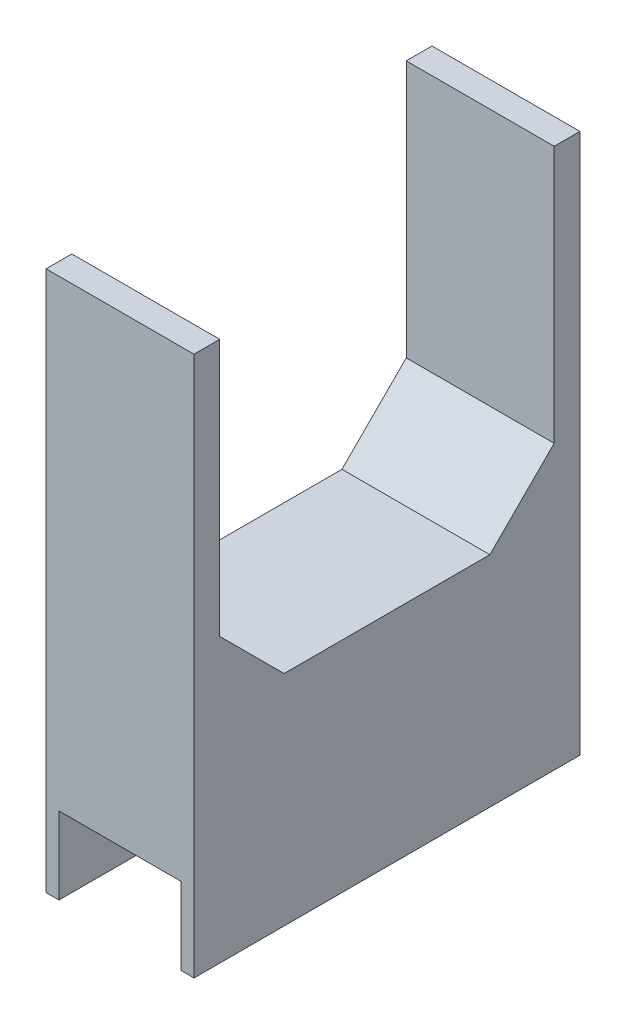
ISO-10303-21;
HEADER;
FILE_DESCRIPTION(('STEP AP214'),'2;1');
FILE_NAME('part.step','',(''),(''),'','','');
FILE_SCHEMA(('AUTOMOTIVE_DESIGN { 1 0 10303 214 1 1 1 1 }'));
ENDSEC;
DATA;
#1=APPLICATION_CONTEXT('core data for automotive mechanical design processes');
#2=APPLICATION_PROTOCOL_DEFINITION('international standard','automotive_design',2000,#1);
#3=PRODUCT_CONTEXT('',#1,'mechanical');
#4=PRODUCT('Part','Part','',(#3));
#5=PRODUCT_RELATED_PRODUCT_CATEGORY('part','',(#4));
#6=PRODUCT_DEFINITION_FORMATION('','',#4);
#7=PRODUCT_DEFINITION_CONTEXT('part definition',#1,'design');
#8=PRODUCT_DEFINITION('design','',#6,#7);
#9=PRODUCT_DEFINITION_SHAPE('','',#8);
#10=(LENGTH_UNIT() NAMED_UNIT(*) SI_UNIT(.MILLI.,.METRE.));
#11=(NAMED_UNIT(*) PLANE_ANGLE_UNIT() SI_UNIT($,.RADIAN.));
#12=(NAMED_UNIT(*) SI_UNIT($,.STERADIAN.) SOLID_ANGLE_UNIT());
#13=UNCERTAINTY_MEASURE_WITH_UNIT(LENGTH_MEASURE(1.E-05),#10,'distance_accuracy_value','');
#14=(GEOMETRIC_REPRESENTATION_CONTEXT(3) GLOBAL_UNCERTAINTY_ASSIGNED_CONTEXT((#13)) GLOBAL_UNIT_ASSIGNED_CONTEXT((#10,
#11,#12)) REPRESENTATION_CONTEXT('',''));
#15=CARTESIAN_POINT('',(0.,0.,0.));
#16=DIRECTION('',(0.,0.,1.));
#17=DIRECTION('',(1.,0.,0.));
#18=AXIS2_PLACEMENT_3D('',#15,#16,#17);
#19=CARTESIAN_POINT('',(0.,36.,0.));
#20=DIRECTION('',(0.,-1.,0.));
#21=DIRECTION('',(0.,0.,-1.));
#22=AXIS2_PLACEMENT_3D('',#19,#20,#21);
#23=PLANE('',#22);
#24=DIRECTION('',(0.,0.,1.));
#25=VECTOR('',#24,1.);
#26=CARTESIAN_POINT('',(-5.75,36.,15.));
#27=LINE('',#26,#25);
#28=CARTESIAN_POINT('',(-5.75,36.,-15.));
#29=VERTEX_POINT('',#28);
#30=CARTESIAN_POINT('',(-5.75,36.,-13.));
#31=VERTEX_POINT('',#30);
#32=EDGE_CURVE('E213',#29,#31,#27,.T.);
#33=ORIENTED_EDGE('',*,*,#32,.T.);
#34=DIRECTION('',(-1.,0.,0.));
#35=VECTOR('',#34,1.);
#36=CARTESIAN_POINT('',(5.75,36.,-13.));
#37=LINE('',#36,#35);
#38=CARTESIAN_POINT('',(5.75,36.,-13.));
#39=VERTEX_POINT('',#38);
#40=EDGE_CURVE('E196',#39,#31,#37,.T.);
#41=ORIENTED_EDGE('',*,*,#40,.F.);
#42=DIRECTION('',(0.,0.,-1.));
#43=VECTOR('',#42,1.);
#44=CARTESIAN_POINT('',(5.75,36.,15.));
#45=LINE('',#44,#43);
#46=CARTESIAN_POINT('',(5.75,36.,-15.));
#47=VERTEX_POINT('',#46);
#48=EDGE_CURVE('E204',#39,#47,#45,.T.);
#49=ORIENTED_EDGE('',*,*,#48,.T.);
#50=DIRECTION('',(-1.,0.,0.));
#51=VECTOR('',#50,1.);
#52=CARTESIAN_POINT('',(-5.75,36.,-15.));
#53=LINE('',#52,#51);
#54=EDGE_CURVE('E203',#47,#29,#53,.T.);
#55=ORIENTED_EDGE('',*,*,#54,.T.);
#56=EDGE_LOOP('',(#33,#41,#49,#55));
#57=FACE_BOUND('',#56,.T.);
#58=ADVANCED_FACE('F47',(#57),#23,.F.);
#59=CARTESIAN_POINT('',(0.,-6.,0.));
#60=DIRECTION('',(0.,1.,0.));
#61=DIRECTION('',(0.,0.,1.));
#62=AXIS2_PLACEMENT_3D('',#59,#60,#61);
#63=PLANE('',#62);
#64=DIRECTION('',(1.,0.,0.));
#65=VECTOR('',#64,1.);
#66=CARTESIAN_POINT('',(-5.75,-6.,-15.));
#67=LINE('',#66,#65);
#68=CARTESIAN_POINT('',(-5.75,-6.,-15.));
#69=VERTEX_POINT('',#68);
#70=CARTESIAN_POINT('',(-4.75,-6.,-15.));
#71=VERTEX_POINT('',#70);
#72=EDGE_CURVE('E313',#69,#71,#67,.T.);
#73=ORIENTED_EDGE('',*,*,#72,.T.);
#74=DIRECTION('',(0.,0.,1.));
#75=VECTOR('',#74,1.);
#76=CARTESIAN_POINT('',(-4.75,-6.,-15.));
#77=LINE('',#76,#75);
#78=CARTESIAN_POINT('',(-4.75,-6.,15.));
#79=VERTEX_POINT('',#78);
#80=EDGE_CURVE('E277',#71,#79,#77,.T.);
#81=ORIENTED_EDGE('',*,*,#80,.T.);
#82=DIRECTION('',(-1.,0.,0.));
#83=VECTOR('',#82,1.);
#84=CARTESIAN_POINT('',(-5.75,-6.,15.));
#85=LINE('',#84,#83);
#86=CARTESIAN_POINT('',(-5.75,-6.,15.));
#87=VERTEX_POINT('',#86);
#88=EDGE_CURVE('E303',#79,#87,#85,.T.);
#89=ORIENTED_EDGE('',*,*,#88,.T.);
#90=DIRECTION('',(0.,0.,-1.));
#91=VECTOR('',#90,1.);
#92=CARTESIAN_POINT('',(-5.75,-6.,-15.));
#93=LINE('',#92,#91);
#94=EDGE_CURVE('E308',#87,#69,#93,.T.);
#95=ORIENTED_EDGE('',*,*,#94,.T.);
#96=EDGE_LOOP('',(#73,#81,#89,#95));
#97=FACE_BOUND('',#96,.T.);
#98=ADVANCED_FACE('F406',(#97),#63,.F.);
#99=CARTESIAN_POINT('',(5.75,11.,15.));
#100=DIRECTION('',(-1.,0.,0.));
#101=DIRECTION('',(0.,0.,1.));
#102=AXIS2_PLACEMENT_3D('',#99,#100,#101);
#103=PLANE('',#102);
#104=ORIENTED_EDGE('',*,*,#48,.F.);
#105=DIRECTION('',(0.,-1.,0.));
#106=VECTOR('',#105,1.);
#107=CARTESIAN_POINT('',(5.75,36.,-13.));
#108=LINE('',#107,#106);
#109=CARTESIAN_POINT('',(5.75,16.,-13.));
#110=VERTEX_POINT('',#109);
#111=EDGE_CURVE('E382',#39,#110,#108,.T.);
#112=ORIENTED_EDGE('',*,*,#111,.T.);
#113=DIRECTION('',(0.,0.707106781186544,-0.707106781186551));
#114=VECTOR('',#113,1.);
#115=CARTESIAN_POINT('',(5.75,-0.499999999999985,3.50000000000013));
#116=LINE('',#115,#114);
#117=CARTESIAN_POINT('',(5.75,11.,-7.99999999999997));
#118=VERTEX_POINT('',#117);
#119=EDGE_CURVE('E11',#110,#118,#116,.F.);
#120=ORIENTED_EDGE('',*,*,#119,.T.);
#121=DIRECTION('',(0.,0.,1.));
#122=VECTOR('',#121,1.);
#123=CARTESIAN_POINT('',(5.75,11.,-13.));
#124=LINE('',#123,#122);
#125=CARTESIAN_POINT('',(5.75,11.,8.00000000000002));
#126=VERTEX_POINT('',#125);
#127=EDGE_CURVE('E187',#118,#126,#124,.T.);
#128=ORIENTED_EDGE('',*,*,#127,.T.);
#129=DIRECTION('',(0.,-0.707106781186551,-0.707106781186544));
#130=VECTOR('',#129,1.);
#131=CARTESIAN_POINT('',(5.75,14.5,11.5));
#132=LINE('',#131,#130);
#133=CARTESIAN_POINT('',(5.75,16.,13.));
#134=VERTEX_POINT('',#133);
#135=EDGE_CURVE('E181',#126,#134,#132,.F.);
#136=ORIENTED_EDGE('',*,*,#135,.T.);
#137=DIRECTION('',(0.,1.,0.));
#138=VECTOR('',#137,1.);
#139=CARTESIAN_POINT('',(5.75,36.,13.));
#140=LINE('',#139,#138);
#141=CARTESIAN_POINT('',(5.75,36.,13.));
#142=VERTEX_POINT('',#141);
#143=EDGE_CURVE('E173',#134,#142,#140,.T.);
#144=ORIENTED_EDGE('',*,*,#143,.T.);
#145=CARTESIAN_POINT('',(5.75,36.,15.));
#146=VERTEX_POINT('',#145);
#147=EDGE_CURVE('E178',#146,#142,#45,.T.);
#148=ORIENTED_EDGE('',*,*,#147,.F.);
#149=DIRECTION('',(0.,-1.,0.));
#150=VECTOR('',#149,1.);
#151=CARTESIAN_POINT('',(5.75,11.,15.));
#152=LINE('',#151,#150);
#153=CARTESIAN_POINT('',(5.75,-6.,15.));
#154=VERTEX_POINT('',#153);
#155=EDGE_CURVE('E317',#146,#154,#152,.T.);
#156=ORIENTED_EDGE('',*,*,#155,.T.);
#157=DIRECTION('',(0.,0.,1.));
#158=VECTOR('',#157,1.);
#159=CARTESIAN_POINT('',(5.75,-6.,-15.));
#160=LINE('',#159,#158);
#161=CARTESIAN_POINT('',(5.75,-6.,-15.));
#162=VERTEX_POINT('',#161);
#163=EDGE_CURVE('E290',#162,#154,#160,.T.);
#164=ORIENTED_EDGE('',*,*,#163,.F.);
#165=DIRECTION('',(0.,-1.,0.));
#166=VECTOR('',#165,1.);
#167=CARTESIAN_POINT('',(5.75,11.,-15.));
#168=LINE('',#167,#166);
#169=EDGE_CURVE('E327',#47,#162,#168,.T.);
#170=ORIENTED_EDGE('',*,*,#169,.F.);
#171=EDGE_LOOP('',(#104,#112,#120,#128,#136,#144,#148,#156,#164,#170));
#172=FACE_BOUND('',#171,.T.);
#173=ADVANCED_FACE('F176',(#172),#103,.F.);
#174=CARTESIAN_POINT('',(-5.75,11.,-15.));
#175=DIRECTION('',(0.,0.,1.));
#176=DIRECTION('',(1.,0.,0.));
#177=AXIS2_PLACEMENT_3D('',#174,#175,#176);
#178=PLANE('',#177);
#179=DIRECTION('',(-1.,0.,0.));
#180=VECTOR('',#179,1.);
#181=CARTESIAN_POINT('',(-4.75,0.,-15.));
#182=LINE('',#181,#180);
#183=CARTESIAN_POINT('',(4.75,0.,-15.));
#184=VERTEX_POINT('',#183);
#185=CARTESIAN_POINT('',(-4.75,0.,-15.));
#186=VERTEX_POINT('',#185);
#187=EDGE_CURVE('E273',#184,#186,#182,.T.);
#188=ORIENTED_EDGE('',*,*,#187,.T.);
#189=DIRECTION('',(0.,-1.,0.));
#190=VECTOR('',#189,1.);
#191=CARTESIAN_POINT('',(-4.75,-6.,-15.));
#192=LINE('',#191,#190);
#193=EDGE_CURVE('E264',#186,#71,#192,.T.);
#194=ORIENTED_EDGE('',*,*,#193,.T.);
#195=ORIENTED_EDGE('',*,*,#72,.F.);
#196=DIRECTION('',(0.,-1.,0.));
#197=VECTOR('',#196,1.);
#198=CARTESIAN_POINT('',(-5.75,11.,-15.));
#199=LINE('',#198,#197);
#200=EDGE_CURVE('E324',#29,#69,#199,.T.);
#201=ORIENTED_EDGE('',*,*,#200,.F.);
#202=ORIENTED_EDGE('',*,*,#54,.F.);
#203=ORIENTED_EDGE('',*,*,#169,.T.);
#204=CARTESIAN_POINT('',(4.75,-6.,-15.));
#205=VERTEX_POINT('',#204);
#206=EDGE_CURVE('E312',#205,#162,#67,.T.);
#207=ORIENTED_EDGE('',*,*,#206,.F.);
#208=DIRECTION('',(0.,1.,0.));
#209=VECTOR('',#208,1.);
#210=CARTESIAN_POINT('',(4.75,-6.,-15.));
#211=LINE('',#210,#209);
#212=EDGE_CURVE('E268',#205,#184,#211,.T.);
#213=ORIENTED_EDGE('',*,*,#212,.T.);
#214=EDGE_LOOP('',(#188,#194,#195,#201,#202,#203,#207,#213));
#215=FACE_BOUND('',#214,.T.);
#216=ADVANCED_FACE('F367',(#215),#178,.F.);
#217=CARTESIAN_POINT('',(-5.75,11.,15.));
#218=DIRECTION('',(1.,0.,0.));
#219=DIRECTION('',(0.,0.,-1.));
#220=AXIS2_PLACEMENT_3D('',#217,#218,#219);
#221=PLANE('',#220);
#222=DIRECTION('',(0.,0.,1.));
#223=VECTOR('',#222,1.);
#224=CARTESIAN_POINT('',(-5.75,11.,-13.));
#225=LINE('',#224,#223);
#226=CARTESIAN_POINT('',(-5.75,11.,-7.99999999999997));
#227=VERTEX_POINT('',#226);
#228=CARTESIAN_POINT('',(-5.75,11.,8.00000000000002));
#229=VERTEX_POINT('',#228);
#230=EDGE_CURVE('E374',#227,#229,#225,.T.);
#231=ORIENTED_EDGE('',*,*,#230,.F.);
#232=DIRECTION('',(0.,-0.707106781186544,0.707106781186551));
#233=VECTOR('',#232,1.);
#234=CARTESIAN_POINT('',(-5.75,-0.499999999999985,3.50000000000013));
#235=LINE('',#234,#233);
#236=CARTESIAN_POINT('',(-5.75,16.,-13.));
#237=VERTEX_POINT('',#236);
#238=EDGE_CURVE('E57',#227,#237,#235,.F.);
#239=ORIENTED_EDGE('',*,*,#238,.T.);
#240=DIRECTION('',(0.,-1.,0.));
#241=VECTOR('',#240,1.);
#242=CARTESIAN_POINT('',(-5.75,36.,-13.));
#243=LINE('',#242,#241);
#244=EDGE_CURVE('E372',#31,#237,#243,.T.);
#245=ORIENTED_EDGE('',*,*,#244,.F.);
#246=ORIENTED_EDGE('',*,*,#32,.F.);
#247=ORIENTED_EDGE('',*,*,#200,.T.);
#248=ORIENTED_EDGE('',*,*,#94,.F.);
#249=DIRECTION('',(0.,-1.,0.));
#250=VECTOR('',#249,1.);
#251=CARTESIAN_POINT('',(-5.75,11.,15.));
#252=LINE('',#251,#250);
#253=CARTESIAN_POINT('',(-5.75,36.,15.));
#254=VERTEX_POINT('',#253);
#255=EDGE_CURVE('E320',#254,#87,#252,.T.);
#256=ORIENTED_EDGE('',*,*,#255,.F.);
#257=CARTESIAN_POINT('',(-5.75,36.,13.));
#258=VERTEX_POINT('',#257);
#259=EDGE_CURVE('E209',#258,#254,#27,.T.);
#260=ORIENTED_EDGE('',*,*,#259,.F.);
#261=DIRECTION('',(0.,1.,0.));
#262=VECTOR('',#261,1.);
#263=CARTESIAN_POINT('',(-5.75,36.,13.));
#264=LINE('',#263,#262);
#265=CARTESIAN_POINT('',(-5.75,16.,13.));
#266=VERTEX_POINT('',#265);
#267=EDGE_CURVE('E192',#266,#258,#264,.T.);
#268=ORIENTED_EDGE('',*,*,#267,.F.);
#269=DIRECTION('',(0.,0.707106781186551,0.707106781186544));
#270=VECTOR('',#269,1.);
#271=CARTESIAN_POINT('',(-5.75,14.5,11.5));
#272=LINE('',#271,#270);
#273=EDGE_CURVE('E343',#266,#229,#272,.F.);
#274=ORIENTED_EDGE('',*,*,#273,.T.);
#275=EDGE_LOOP('',(#231,#239,#245,#246,#247,#248,#256,#260,#268,#274));
#276=FACE_BOUND('',#275,.T.);
#277=ADVANCED_FACE('F353',(#276),#221,.F.);
#278=CARTESIAN_POINT('',(-5.75,11.,15.));
#279=DIRECTION('',(0.,0.,-1.));
#280=DIRECTION('',(-1.,0.,0.));
#281=AXIS2_PLACEMENT_3D('',#278,#279,#280);
#282=PLANE('',#281);
#283=ORIENTED_EDGE('',*,*,#88,.F.);
#284=DIRECTION('',(0.,-1.,0.));
#285=VECTOR('',#284,1.);
#286=CARTESIAN_POINT('',(-4.75,-6.,15.));
#287=LINE('',#286,#285);
#288=CARTESIAN_POINT('',(-4.75,0.,15.));
#289=VERTEX_POINT('',#288);
#290=EDGE_CURVE('E254',#289,#79,#287,.T.);
#291=ORIENTED_EDGE('',*,*,#290,.F.);
#292=DIRECTION('',(-1.,0.,0.));
#293=VECTOR('',#292,1.);
#294=CARTESIAN_POINT('',(-4.75,0.,15.));
#295=LINE('',#294,#293);
#296=CARTESIAN_POINT('',(4.75,0.,15.));
#297=VERTEX_POINT('',#296);
#298=EDGE_CURVE('E269',#297,#289,#295,.T.);
#299=ORIENTED_EDGE('',*,*,#298,.F.);
#300=DIRECTION('',(0.,1.,0.));
#301=VECTOR('',#300,1.);
#302=CARTESIAN_POINT('',(4.75,-6.,15.));
#303=LINE('',#302,#301);
#304=CARTESIAN_POINT('',(4.75,-6.,15.));
#305=VERTEX_POINT('',#304);
#306=EDGE_CURVE('E280',#305,#297,#303,.T.);
#307=ORIENTED_EDGE('',*,*,#306,.F.);
#308=EDGE_CURVE('E304',#154,#305,#85,.T.);
#309=ORIENTED_EDGE('',*,*,#308,.F.);
#310=ORIENTED_EDGE('',*,*,#155,.F.);
#311=DIRECTION('',(1.,0.,0.));
#312=VECTOR('',#311,1.);
#313=CARTESIAN_POINT('',(-5.75,36.,15.));
#314=LINE('',#313,#312);
#315=EDGE_CURVE('E201',#254,#146,#314,.T.);
#316=ORIENTED_EDGE('',*,*,#315,.F.);
#317=ORIENTED_EDGE('',*,*,#255,.T.);
#318=EDGE_LOOP('',(#283,#291,#299,#307,#309,#310,#316,#317));
#319=FACE_BOUND('',#318,.T.);
#320=ADVANCED_FACE('F356',(#319),#282,.F.);
#321=ORIENTED_EDGE('',*,*,#308,.T.);
#322=DIRECTION('',(0.,0.,1.));
#323=VECTOR('',#322,1.);
#324=CARTESIAN_POINT('',(4.75,-6.,-15.));
#325=LINE('',#324,#323);
#326=EDGE_CURVE('E294',#205,#305,#325,.T.);
#327=ORIENTED_EDGE('',*,*,#326,.F.);
#328=ORIENTED_EDGE('',*,*,#206,.T.);
#329=ORIENTED_EDGE('',*,*,#163,.T.);
#330=EDGE_LOOP('',(#321,#327,#328,#329));
#331=FACE_BOUND('',#330,.T.);
#332=ADVANCED_FACE('F363',(#331),#63,.F.);
#333=CARTESIAN_POINT('',(-4.75,-6.,-15.));
#334=DIRECTION('',(-1.,0.,0.));
#335=DIRECTION('',(0.,-1.,0.));
#336=AXIS2_PLACEMENT_3D('',#333,#334,#335);
#337=PLANE('',#336);
#338=ORIENTED_EDGE('',*,*,#290,.T.);
#339=ORIENTED_EDGE('',*,*,#80,.F.);
#340=ORIENTED_EDGE('',*,*,#193,.F.);
#341=DIRECTION('',(0.,0.,1.));
#342=VECTOR('',#341,1.);
#343=CARTESIAN_POINT('',(-4.75,0.,-15.));
#344=LINE('',#343,#342);
#345=EDGE_CURVE('E287',#186,#289,#344,.T.);
#346=ORIENTED_EDGE('',*,*,#345,.T.);
#347=EDGE_LOOP('',(#338,#339,#340,#346));
#348=FACE_BOUND('',#347,.T.);
#349=ADVANCED_FACE('F448',(#348),#337,.F.);
#350=CARTESIAN_POINT('',(-4.75,0.,-15.));
#351=DIRECTION('',(0.,1.,0.));
#352=DIRECTION('',(0.,0.,1.));
#353=AXIS2_PLACEMENT_3D('',#350,#351,#352);
#354=PLANE('',#353);
#355=DIRECTION('',(-1.,0.,0.));
#356=VECTOR('',#355,1.);
#357=CARTESIAN_POINT('',(-1.,0.,3.));
#358=LINE('',#357,#356);
#359=CARTESIAN_POINT('',(1.,0.,3.));
#360=VERTEX_POINT('',#359);
#361=CARTESIAN_POINT('',(-1.,0.,3.));
#362=VERTEX_POINT('',#361);
#363=EDGE_CURVE('E240',#360,#362,#358,.T.);
#364=ORIENTED_EDGE('',*,*,#363,.F.);
#365=DIRECTION('',(0.,0.,1.));
#366=VECTOR('',#365,1.);
#367=CARTESIAN_POINT('',(1.,0.,-3.));
#368=LINE('',#367,#366);
#369=CARTESIAN_POINT('',(1.,0.,-3.));
#370=VERTEX_POINT('',#369);
#371=EDGE_CURVE('E219',#370,#360,#368,.T.);
#372=ORIENTED_EDGE('',*,*,#371,.F.);
#373=DIRECTION('',(1.,0.,0.));
#374=VECTOR('',#373,1.);
#375=CARTESIAN_POINT('',(-1.,0.,-3.));
#376=LINE('',#375,#374);
#377=CARTESIAN_POINT('',(-1.,0.,-3.));
#378=VERTEX_POINT('',#377);
#379=EDGE_CURVE('E225',#378,#370,#376,.T.);
#380=ORIENTED_EDGE('',*,*,#379,.F.);
#381=DIRECTION('',(0.,0.,-1.));
#382=VECTOR('',#381,1.);
#383=CARTESIAN_POINT('',(-1.,0.,-3.));
#384=LINE('',#383,#382);
#385=EDGE_CURVE('E244',#362,#378,#384,.T.);
#386=ORIENTED_EDGE('',*,*,#385,.F.);
#387=EDGE_LOOP('',(#364,#372,#380,#386));
#388=FACE_BOUND('',#387,.T.);
#389=ORIENTED_EDGE('',*,*,#298,.T.);
#390=ORIENTED_EDGE('',*,*,#345,.F.);
#391=ORIENTED_EDGE('',*,*,#187,.F.);
#392=DIRECTION('',(0.,0.,1.));
#393=VECTOR('',#392,1.);
#394=CARTESIAN_POINT('',(4.75,0.,-15.));
#395=LINE('',#394,#393);
#396=EDGE_CURVE('E291',#184,#297,#395,.T.);
#397=ORIENTED_EDGE('',*,*,#396,.T.);
#398=EDGE_LOOP('',(#389,#390,#391,#397));
#399=FACE_BOUND('',#398,.T.);
#400=ADVANCED_FACE('F445',(#388,#399),#354,.F.);
#401=CARTESIAN_POINT('',(4.75,-6.,-15.));
#402=DIRECTION('',(1.,0.,0.));
#403=DIRECTION('',(0.,0.,-1.));
#404=AXIS2_PLACEMENT_3D('',#401,#402,#403);
#405=PLANE('',#404);
#406=ORIENTED_EDGE('',*,*,#306,.T.);
#407=ORIENTED_EDGE('',*,*,#396,.F.);
#408=ORIENTED_EDGE('',*,*,#212,.F.);
#409=ORIENTED_EDGE('',*,*,#326,.T.);
#410=EDGE_LOOP('',(#406,#407,#408,#409));
#411=FACE_BOUND('',#410,.T.);
#412=ADVANCED_FACE('F443',(#411),#405,.F.);
#413=CARTESIAN_POINT('',(1.,10.,-3.));
#414=DIRECTION('',(1.,0.,0.));
#415=DIRECTION('',(0.,0.,-1.));
#416=AXIS2_PLACEMENT_3D('',#413,#414,#415);
#417=PLANE('',#416);
#418=ORIENTED_EDGE('',*,*,#371,.T.);
#419=DIRECTION('',(0.,-1.,0.));
#420=VECTOR('',#419,1.);
#421=CARTESIAN_POINT('',(1.,10.,3.));
#422=LINE('',#421,#420);
#423=CARTESIAN_POINT('',(1.,10.,3.));
#424=VERTEX_POINT('',#423);
#425=EDGE_CURVE('E237',#424,#360,#422,.T.);
#426=ORIENTED_EDGE('',*,*,#425,.F.);
#427=DIRECTION('',(0.,0.,1.));
#428=VECTOR('',#427,1.);
#429=CARTESIAN_POINT('',(1.,10.,-3.));
#430=LINE('',#429,#428);
#431=CARTESIAN_POINT('',(1.,10.,-3.));
#432=VERTEX_POINT('',#431);
#433=EDGE_CURVE('E220',#432,#424,#430,.T.);
#434=ORIENTED_EDGE('',*,*,#433,.F.);
#435=DIRECTION('',(0.,-1.,0.));
#436=VECTOR('',#435,1.);
#437=CARTESIAN_POINT('',(1.,10.,-3.));
#438=LINE('',#437,#436);
#439=EDGE_CURVE('E251',#432,#370,#438,.T.);
#440=ORIENTED_EDGE('',*,*,#439,.T.);
#441=EDGE_LOOP('',(#418,#426,#434,#440));
#442=FACE_BOUND('',#441,.T.);
#443=ADVANCED_FACE('F436',(#442),#417,.F.);
#444=CARTESIAN_POINT('',(-1.,10.,-3.));
#445=DIRECTION('',(0.,0.,-1.));
#446=DIRECTION('',(-1.,0.,0.));
#447=AXIS2_PLACEMENT_3D('',#444,#445,#446);
#448=PLANE('',#447);
#449=ORIENTED_EDGE('',*,*,#379,.T.);
#450=ORIENTED_EDGE('',*,*,#439,.F.);
#451=DIRECTION('',(1.,0.,0.));
#452=VECTOR('',#451,1.);
#453=CARTESIAN_POINT('',(-1.,10.,-3.));
#454=LINE('',#453,#452);
#455=CARTESIAN_POINT('',(-1.,10.,-3.));
#456=VERTEX_POINT('',#455);
#457=EDGE_CURVE('E233',#456,#432,#454,.T.);
#458=ORIENTED_EDGE('',*,*,#457,.F.);
#459=DIRECTION('',(0.,-1.,0.));
#460=VECTOR('',#459,1.);
#461=CARTESIAN_POINT('',(-1.,10.,-3.));
#462=LINE('',#461,#460);
#463=EDGE_CURVE('E255',#456,#378,#462,.T.);
#464=ORIENTED_EDGE('',*,*,#463,.T.);
#465=EDGE_LOOP('',(#449,#450,#458,#464));
#466=FACE_BOUND('',#465,.T.);
#467=ADVANCED_FACE('F433',(#466),#448,.F.);
#468=CARTESIAN_POINT('',(-1.,10.,-3.));
#469=DIRECTION('',(-1.,0.,0.));
#470=DIRECTION('',(0.,0.,1.));
#471=AXIS2_PLACEMENT_3D('',#468,#469,#470);
#472=PLANE('',#471);
#473=ORIENTED_EDGE('',*,*,#385,.T.);
#474=ORIENTED_EDGE('',*,*,#463,.F.);
#475=DIRECTION('',(0.,0.,-1.));
#476=VECTOR('',#475,1.);
#477=CARTESIAN_POINT('',(-1.,10.,-3.));
#478=LINE('',#477,#476);
#479=CARTESIAN_POINT('',(-1.,10.,3.));
#480=VERTEX_POINT('',#479);
#481=EDGE_CURVE('E229',#480,#456,#478,.T.);
#482=ORIENTED_EDGE('',*,*,#481,.F.);
#483=DIRECTION('',(0.,-1.,0.));
#484=VECTOR('',#483,1.);
#485=CARTESIAN_POINT('',(-1.,10.,3.));
#486=LINE('',#485,#484);
#487=EDGE_CURVE('E258',#480,#362,#486,.T.);
#488=ORIENTED_EDGE('',*,*,#487,.T.);
#489=EDGE_LOOP('',(#473,#474,#482,#488));
#490=FACE_BOUND('',#489,.T.);
#491=ADVANCED_FACE('F429',(#490),#472,.F.);
#492=CARTESIAN_POINT('',(-1.,10.,3.));
#493=DIRECTION('',(0.,0.,1.));
#494=DIRECTION('',(1.,0.,0.));
#495=AXIS2_PLACEMENT_3D('',#492,#493,#494);
#496=PLANE('',#495);
#497=ORIENTED_EDGE('',*,*,#363,.T.);
#498=ORIENTED_EDGE('',*,*,#487,.F.);
#499=DIRECTION('',(-1.,0.,0.));
#500=VECTOR('',#499,1.);
#501=CARTESIAN_POINT('',(-1.,10.,3.));
#502=LINE('',#501,#500);
#503=EDGE_CURVE('E224',#424,#480,#502,.T.);
#504=ORIENTED_EDGE('',*,*,#503,.F.);
#505=ORIENTED_EDGE('',*,*,#425,.T.);
#506=EDGE_LOOP('',(#497,#498,#504,#505));
#507=FACE_BOUND('',#506,.T.);
#508=ADVANCED_FACE('F423',(#507),#496,.F.);
#509=CARTESIAN_POINT('',(0.,10.,0.));
#510=DIRECTION('',(0.,1.,0.));
#511=DIRECTION('',(0.,0.,1.));
#512=AXIS2_PLACEMENT_3D('',#509,#510,#511);
#513=PLANE('',#512);
#514=ORIENTED_EDGE('',*,*,#433,.T.);
#515=ORIENTED_EDGE('',*,*,#503,.T.);
#516=ORIENTED_EDGE('',*,*,#481,.T.);
#517=ORIENTED_EDGE('',*,*,#457,.T.);
#518=EDGE_LOOP('',(#514,#515,#516,#517));
#519=FACE_BOUND('',#518,.T.);
#520=ADVANCED_FACE('F417',(#519),#513,.F.);
#521=ORIENTED_EDGE('',*,*,#147,.T.);
#522=DIRECTION('',(-1.,0.,0.));
#523=VECTOR('',#522,1.);
#524=CARTESIAN_POINT('',(5.75,36.,13.));
#525=LINE('',#524,#523);
#526=EDGE_CURVE('E186',#142,#258,#525,.T.);
#527=ORIENTED_EDGE('',*,*,#526,.T.);
#528=ORIENTED_EDGE('',*,*,#259,.T.);
#529=ORIENTED_EDGE('',*,*,#315,.T.);
#530=EDGE_LOOP('',(#521,#527,#528,#529));
#531=FACE_BOUND('',#530,.T.);
#532=ADVANCED_FACE('F199',(#531),#23,.F.);
#533=CARTESIAN_POINT('',(5.75,36.,-13.));
#534=DIRECTION('',(0.,0.,-1.));
#535=DIRECTION('',(0.,1.,0.));
#536=AXIS2_PLACEMENT_3D('',#533,#534,#535);
#537=PLANE('',#536);
#538=ORIENTED_EDGE('',*,*,#244,.T.);
#539=DIRECTION('',(1.,0.,0.));
#540=VECTOR('',#539,1.);
#541=CARTESIAN_POINT('',(5.75,16.,-13.));
#542=LINE('',#541,#540);
#543=EDGE_CURVE('E64',#237,#110,#542,.T.);
#544=ORIENTED_EDGE('',*,*,#543,.T.);
#545=ORIENTED_EDGE('',*,*,#111,.F.);
#546=ORIENTED_EDGE('',*,*,#40,.T.);
#547=EDGE_LOOP('',(#538,#544,#545,#546));
#548=FACE_BOUND('',#547,.T.);
#549=ADVANCED_FACE('F384',(#548),#537,.F.);
#550=CARTESIAN_POINT('',(5.75,36.,13.));
#551=DIRECTION('',(0.,0.,1.));
#552=DIRECTION('',(0.,-1.,0.));
#553=AXIS2_PLACEMENT_3D('',#550,#551,#552);
#554=PLANE('',#553);
#555=ORIENTED_EDGE('',*,*,#143,.F.);
#556=DIRECTION('',(-1.,0.,0.));
#557=VECTOR('',#556,1.);
#558=CARTESIAN_POINT('',(-5.75,16.,13.));
#559=LINE('',#558,#557);
#560=EDGE_CURVE('E331',#134,#266,#559,.T.);
#561=ORIENTED_EDGE('',*,*,#560,.T.);
#562=ORIENTED_EDGE('',*,*,#267,.T.);
#563=ORIENTED_EDGE('',*,*,#526,.F.);
#564=EDGE_LOOP('',(#555,#561,#562,#563));
#565=FACE_BOUND('',#564,.T.);
#566=ADVANCED_FACE('F190',(#565),#554,.F.);
#567=CARTESIAN_POINT('',(5.75,11.,-13.));
#568=DIRECTION('',(0.,-1.,0.));
#569=DIRECTION('',(0.,0.,-1.));
#570=AXIS2_PLACEMENT_3D('',#567,#568,#569);
#571=PLANE('',#570);
#572=ORIENTED_EDGE('',*,*,#230,.T.);
#573=DIRECTION('',(1.,0.,0.));
#574=VECTOR('',#573,1.);
#575=CARTESIAN_POINT('',(5.75,11.,8.00000000000002));
#576=LINE('',#575,#574);
#577=EDGE_CURVE('E338',#229,#126,#576,.T.);
#578=ORIENTED_EDGE('',*,*,#577,.T.);
#579=ORIENTED_EDGE('',*,*,#127,.F.);
#580=DIRECTION('',(-1.,0.,0.));
#581=VECTOR('',#580,1.);
#582=CARTESIAN_POINT('',(-5.75,11.,-7.99999999999997));
#583=LINE('',#582,#581);
#584=EDGE_CURVE('E334',#118,#227,#583,.T.);
#585=ORIENTED_EDGE('',*,*,#584,.T.);
#586=EDGE_LOOP('',(#572,#578,#579,#585));
#587=FACE_BOUND('',#586,.T.);
#588=ADVANCED_FACE('F392',(#587),#571,.F.);
#589=CARTESIAN_POINT('',(5.75,16.,13.));
#590=DIRECTION('',(0.,0.707106781186544,-0.707106781186551));
#591=DIRECTION('',(1.,0.,0.));
#592=AXIS2_PLACEMENT_3D('',#589,#590,#591);
#593=PLANE('',#592);
#594=ORIENTED_EDGE('',*,*,#135,.F.);
#595=ORIENTED_EDGE('',*,*,#577,.F.);
#596=ORIENTED_EDGE('',*,*,#273,.F.);
#597=ORIENTED_EDGE('',*,*,#560,.F.);
#598=EDGE_LOOP('',(#594,#595,#596,#597));
#599=FACE_BOUND('',#598,.T.);
#600=ADVANCED_FACE('F395',(#599),#593,.T.);
#601=CARTESIAN_POINT('',(5.75,11.,-7.99999999999997));
#602=DIRECTION('',(0.,0.707106781186551,0.707106781186544));
#603=DIRECTION('',(1.,0.,0.));
#604=AXIS2_PLACEMENT_3D('',#601,#602,#603);
#605=PLANE('',#604);
#606=ORIENTED_EDGE('',*,*,#119,.F.);
#607=ORIENTED_EDGE('',*,*,#543,.F.);
#608=ORIENTED_EDGE('',*,*,#238,.F.);
#609=ORIENTED_EDGE('',*,*,#584,.F.);
#610=EDGE_LOOP('',(#606,#607,#608,#609));
#611=FACE_BOUND('',#610,.T.);
#612=ADVANCED_FACE('F50',(#611),#605,.T.);
#613=CLOSED_SHELL('',(#58,#98,#173,#216,#277,#320,#332,#349,#400,#412,#443,#467,#491,#508,#520,
#532,#549,#566,#588,#600,#612));
#614=MANIFOLD_SOLID_BREP('B2',#613);
#615=ADVANCED_BREP_SHAPE_REPRESENTATION('',(#18,#614),#14);
#616=SHAPE_DEFINITION_REPRESENTATION(#9,#615);
ENDSEC;
END-ISO-10303-21;
